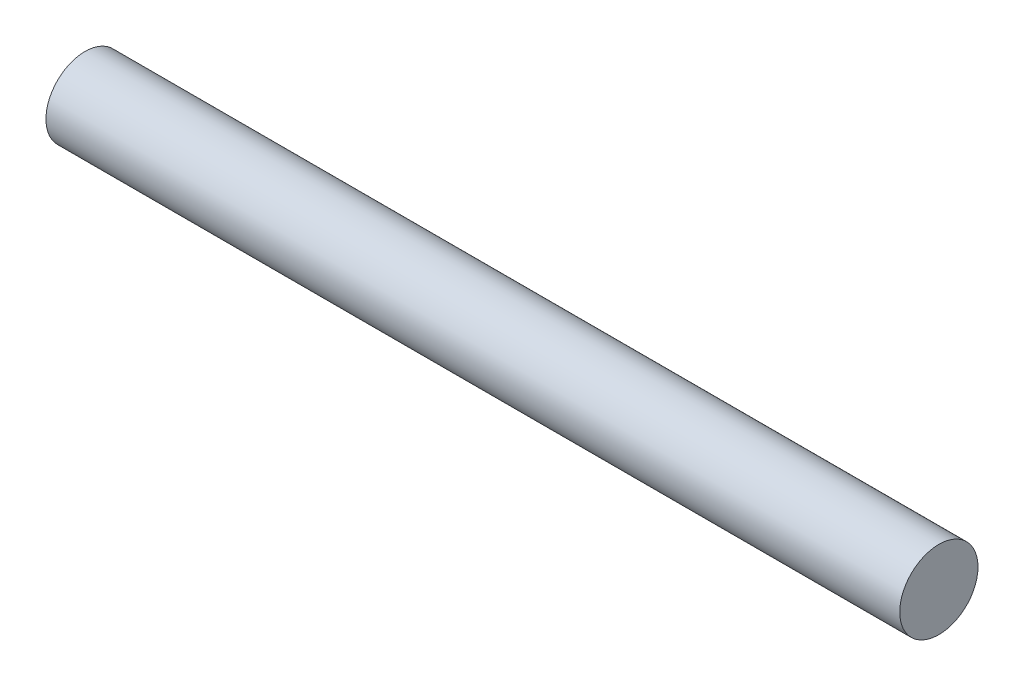
ISO-10303-21;
HEADER;
FILE_DESCRIPTION(('STEP AP214'),'2;1');
FILE_NAME('part.step','',(''),(''),'','','');
FILE_SCHEMA(('AUTOMOTIVE_DESIGN { 1 0 10303 214 1 1 1 1 }'));
ENDSEC;
DATA;
#1=APPLICATION_CONTEXT('core data for automotive mechanical design processes');
#2=APPLICATION_PROTOCOL_DEFINITION('international standard','automotive_design',2000,#1);
#3=PRODUCT_CONTEXT('',#1,'mechanical');
#4=PRODUCT('Part','Part','',(#3));
#5=PRODUCT_RELATED_PRODUCT_CATEGORY('part','',(#4));
#6=PRODUCT_DEFINITION_FORMATION('','',#4);
#7=PRODUCT_DEFINITION_CONTEXT('part definition',#1,'design');
#8=PRODUCT_DEFINITION('design','',#6,#7);
#9=PRODUCT_DEFINITION_SHAPE('','',#8);
#10=(LENGTH_UNIT() NAMED_UNIT(*) SI_UNIT(.MILLI.,.METRE.));
#11=(NAMED_UNIT(*) PLANE_ANGLE_UNIT() SI_UNIT($,.RADIAN.));
#12=(NAMED_UNIT(*) SI_UNIT($,.STERADIAN.) SOLID_ANGLE_UNIT());
#13=UNCERTAINTY_MEASURE_WITH_UNIT(LENGTH_MEASURE(1.E-05),#10,'distance_accuracy_value','');
#14=(GEOMETRIC_REPRESENTATION_CONTEXT(3) GLOBAL_UNCERTAINTY_ASSIGNED_CONTEXT((#13)) GLOBAL_UNIT_ASSIGNED_CONTEXT((#10,
#11,#12)) REPRESENTATION_CONTEXT('',''));
#15=CARTESIAN_POINT('',(0.,0.,0.));
#16=DIRECTION('',(0.,0.,1.));
#17=DIRECTION('',(1.,0.,0.));
#18=AXIS2_PLACEMENT_3D('',#15,#16,#17);
#19=CARTESIAN_POINT('',(10.9093683897783,0.,0.));
#20=DIRECTION('',(-1.,0.,0.));
#21=DIRECTION('',(0.,0.,1.));
#22=AXIS2_PLACEMENT_3D('',#19,#20,#21);
#23=CYLINDRICAL_SURFACE('',#22,1.);
#24=CARTESIAN_POINT('',(10.9093683897783,0.,0.));
#25=DIRECTION('',(1.,0.,0.));
#26=DIRECTION('',(0.,0.,-1.));
#27=AXIS2_PLACEMENT_3D('',#24,#25,#26);
#28=CIRCLE('',#27,1.);
#29=CARTESIAN_POINT('',(10.9093683897783,0.,-1.));
#30=VERTEX_POINT('',#29);
#31=EDGE_CURVE('E10',#30,#30,#28,.T.);
#32=ORIENTED_EDGE('',*,*,#31,.F.);
#33=EDGE_LOOP('',(#32));
#34=FACE_BOUND('',#33,.T.);
#35=CARTESIAN_POINT('',(-10.9093683897783,0.,0.));
#36=DIRECTION('',(1.,0.,0.));
#37=DIRECTION('',(0.,0.,-1.));
#38=AXIS2_PLACEMENT_3D('',#35,#36,#37);
#39=CIRCLE('',#38,1.);
#40=CARTESIAN_POINT('',(-10.9093683897783,0.,-1.));
#41=VERTEX_POINT('',#40);
#42=EDGE_CURVE('E48',#41,#41,#39,.T.);
#43=ORIENTED_EDGE('',*,*,#42,.T.);
#44=EDGE_LOOP('',(#43));
#45=FACE_BOUND('',#44,.T.);
#46=ADVANCED_FACE('F45',(#34,#45),#23,.T.);
#47=CARTESIAN_POINT('',(10.9093683897783,0.,0.));
#48=DIRECTION('',(1.,0.,0.));
#49=DIRECTION('',(0.,0.,-1.));
#50=AXIS2_PLACEMENT_3D('',#47,#48,#49);
#51=PLANE('',#50);
#52=ORIENTED_EDGE('',*,*,#31,.T.);
#53=EDGE_LOOP('',(#52));
#54=FACE_BOUND('',#53,.T.);
#55=ADVANCED_FACE('F62',(#54),#51,.T.);
#56=CARTESIAN_POINT('',(-10.9093683897783,0.,0.));
#57=DIRECTION('',(1.,0.,0.));
#58=DIRECTION('',(0.,0.,-1.));
#59=AXIS2_PLACEMENT_3D('',#56,#57,#58);
#60=PLANE('',#59);
#61=ORIENTED_EDGE('',*,*,#42,.F.);
#62=EDGE_LOOP('',(#61));
#63=FACE_BOUND('',#62,.T.);
#64=ADVANCED_FACE('F60',(#63),#60,.F.);
#65=CLOSED_SHELL('',(#46,#55,#64));
#66=MANIFOLD_SOLID_BREP('B2',#65);
#67=ADVANCED_BREP_SHAPE_REPRESENTATION('',(#18,#66),#14);
#68=SHAPE_DEFINITION_REPRESENTATION(#9,#67);
ENDSEC;
END-ISO-10303-21;
